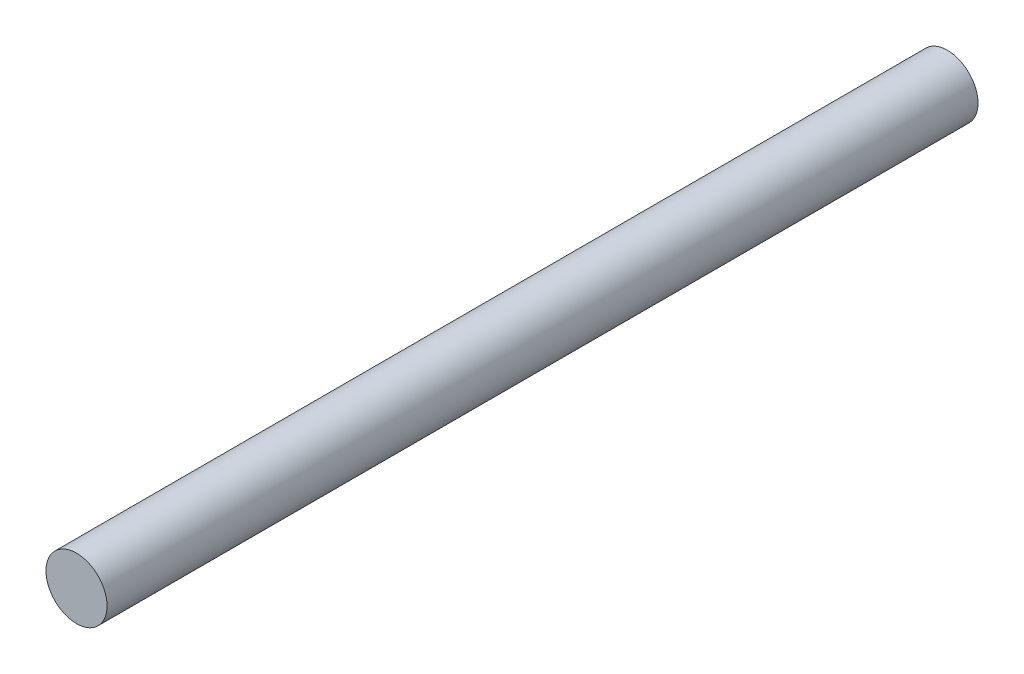
ISO-10303-21;
HEADER;
FILE_DESCRIPTION(('STEP AP214'),'2;1');
FILE_NAME('part.step','',(''),(''),'','','');
FILE_SCHEMA(('AUTOMOTIVE_DESIGN { 1 0 10303 214 1 1 1 1 }'));
ENDSEC;
DATA;
#1=APPLICATION_CONTEXT('core data for automotive mechanical design processes');
#2=APPLICATION_PROTOCOL_DEFINITION('international standard','automotive_design',2000,#1);
#3=PRODUCT_CONTEXT('',#1,'mechanical');
#4=PRODUCT('Part','Part','',(#3));
#5=PRODUCT_RELATED_PRODUCT_CATEGORY('part','',(#4));
#6=PRODUCT_DEFINITION_FORMATION('','',#4);
#7=PRODUCT_DEFINITION_CONTEXT('part definition',#1,'design');
#8=PRODUCT_DEFINITION('design','',#6,#7);
#9=PRODUCT_DEFINITION_SHAPE('','',#8);
#10=(LENGTH_UNIT() NAMED_UNIT(*) SI_UNIT(.MILLI.,.METRE.));
#11=(NAMED_UNIT(*) PLANE_ANGLE_UNIT() SI_UNIT($,.RADIAN.));
#12=(NAMED_UNIT(*) SI_UNIT($,.STERADIAN.) SOLID_ANGLE_UNIT());
#13=UNCERTAINTY_MEASURE_WITH_UNIT(LENGTH_MEASURE(1.E-05),#10,'distance_accuracy_value','');
#14=(GEOMETRIC_REPRESENTATION_CONTEXT(3) GLOBAL_UNCERTAINTY_ASSIGNED_CONTEXT((#13)) GLOBAL_UNIT_ASSIGNED_CONTEXT((#10,
#11,#12)) REPRESENTATION_CONTEXT('',''));
#15=CARTESIAN_POINT('',(0.,0.,0.));
#16=DIRECTION('',(0.,0.,1.));
#17=DIRECTION('',(1.,0.,0.));
#18=AXIS2_PLACEMENT_3D('',#15,#16,#17);
#19=CARTESIAN_POINT('',(0.,0.,85.5));
#20=DIRECTION('',(0.,0.,-1.));
#21=DIRECTION('',(-1.,0.,0.));
#22=AXIS2_PLACEMENT_3D('',#19,#20,#21);
#23=CYLINDRICAL_SURFACE('',#22,3.);
#24=CARTESIAN_POINT('',(0.,0.,85.5));
#25=DIRECTION('',(0.,0.,1.));
#26=DIRECTION('',(1.,0.,0.));
#27=AXIS2_PLACEMENT_3D('',#24,#25,#26);
#28=CIRCLE('',#27,3.);
#29=CARTESIAN_POINT('',(3.,0.,85.5));
#30=VERTEX_POINT('',#29);
#31=EDGE_CURVE('E10',#30,#30,#28,.T.);
#32=ORIENTED_EDGE('',*,*,#31,.F.);
#33=EDGE_LOOP('',(#32));
#34=FACE_BOUND('',#33,.T.);
#35=CARTESIAN_POINT('',(0.,0.,0.));
#36=DIRECTION('',(0.,0.,1.));
#37=DIRECTION('',(1.,0.,0.));
#38=AXIS2_PLACEMENT_3D('',#35,#36,#37);
#39=CIRCLE('',#38,3.);
#40=CARTESIAN_POINT('',(3.,0.,0.));
#41=VERTEX_POINT('',#40);
#42=EDGE_CURVE('E34',#41,#41,#39,.T.);
#43=ORIENTED_EDGE('',*,*,#42,.T.);
#44=EDGE_LOOP('',(#43));
#45=FACE_BOUND('',#44,.T.);
#46=ADVANCED_FACE('F31',(#34,#45),#23,.T.);
#47=CARTESIAN_POINT('',(0.,0.,85.5));
#48=DIRECTION('',(0.,0.,1.));
#49=DIRECTION('',(1.,0.,0.));
#50=AXIS2_PLACEMENT_3D('',#47,#48,#49);
#51=PLANE('',#50);
#52=ORIENTED_EDGE('',*,*,#31,.T.);
#53=EDGE_LOOP('',(#52));
#54=FACE_BOUND('',#53,.T.);
#55=ADVANCED_FACE('F46',(#54),#51,.T.);
#56=CARTESIAN_POINT('',(0.,0.,0.));
#57=DIRECTION('',(0.,0.,1.));
#58=DIRECTION('',(1.,0.,0.));
#59=AXIS2_PLACEMENT_3D('',#56,#57,#58);
#60=PLANE('',#59);
#61=ORIENTED_EDGE('',*,*,#42,.F.);
#62=EDGE_LOOP('',(#61));
#63=FACE_BOUND('',#62,.T.);
#64=ADVANCED_FACE('F44',(#63),#60,.F.);
#65=CLOSED_SHELL('',(#46,#55,#64));
#66=MANIFOLD_SOLID_BREP('B2',#65);
#67=ADVANCED_BREP_SHAPE_REPRESENTATION('',(#18,#66),#14);
#68=SHAPE_DEFINITION_REPRESENTATION(#9,#67);
ENDSEC;
END-ISO-10303-21;
